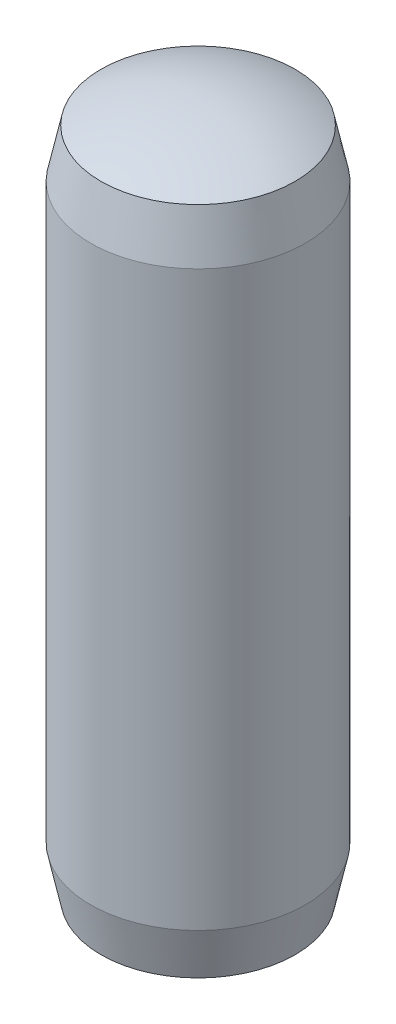
ISO-10303-21;
HEADER;
FILE_DESCRIPTION(('STEP AP214'),'2;1');
FILE_NAME('part.step','',(''),(''),'','','');
FILE_SCHEMA(('AUTOMOTIVE_DESIGN { 1 0 10303 214 1 1 1 1 }'));
ENDSEC;
DATA;
#1=APPLICATION_CONTEXT('core data for automotive mechanical design processes');
#2=APPLICATION_PROTOCOL_DEFINITION('international standard','automotive_design',2000,#1);
#3=PRODUCT_CONTEXT('',#1,'mechanical');
#4=PRODUCT('Part','Part','',(#3));
#5=PRODUCT_RELATED_PRODUCT_CATEGORY('part','',(#4));
#6=PRODUCT_DEFINITION_FORMATION('','',#4);
#7=PRODUCT_DEFINITION_CONTEXT('part definition',#1,'design');
#8=PRODUCT_DEFINITION('design','',#6,#7);
#9=PRODUCT_DEFINITION_SHAPE('','',#8);
#10=(LENGTH_UNIT() NAMED_UNIT(*) SI_UNIT(.MILLI.,.METRE.));
#11=(NAMED_UNIT(*) PLANE_ANGLE_UNIT() SI_UNIT($,.RADIAN.));
#12=(NAMED_UNIT(*) SI_UNIT($,.STERADIAN.) SOLID_ANGLE_UNIT());
#13=UNCERTAINTY_MEASURE_WITH_UNIT(LENGTH_MEASURE(1.E-05),#10,'distance_accuracy_value','');
#14=(GEOMETRIC_REPRESENTATION_CONTEXT(3) GLOBAL_UNCERTAINTY_ASSIGNED_CONTEXT((#13)) GLOBAL_UNIT_ASSIGNED_CONTEXT((#10,
#11,#12)) REPRESENTATION_CONTEXT('',''));
#15=CARTESIAN_POINT('',(0.,0.,0.));
#16=DIRECTION('',(0.,0.,1.));
#17=DIRECTION('',(1.,0.,0.));
#18=AXIS2_PLACEMENT_3D('',#15,#16,#17);
#19=CARTESIAN_POINT('',(0.,5.,0.));
#20=DIRECTION('',(0.,-1.,0.));
#21=DIRECTION('',(0.,0.,-1.));
#22=AXIS2_PLACEMENT_3D('',#19,#20,#21);
#23=CYLINDRICAL_SURFACE('',#22,0.75);
#24=CARTESIAN_POINT('',(0.,4.5,0.));
#25=DIRECTION('',(0.,-1.,0.));
#26=DIRECTION('',(0.,0.,-1.));
#27=AXIS2_PLACEMENT_3D('',#24,#25,#26);
#28=CIRCLE('',#27,0.75);
#29=CARTESIAN_POINT('',(0.,4.5,-0.75));
#30=VERTEX_POINT('',#29);
#31=EDGE_CURVE('E11',#30,#30,#28,.T.);
#32=ORIENTED_EDGE('',*,*,#31,.T.);
#33=EDGE_LOOP('',(#32));
#34=FACE_BOUND('',#33,.T.);
#35=CARTESIAN_POINT('',(0.,0.5,0.));
#36=DIRECTION('',(0.,-1.,0.));
#37=DIRECTION('',(0.,0.,-1.));
#38=AXIS2_PLACEMENT_3D('',#35,#36,#37);
#39=CIRCLE('',#38,0.75);
#40=CARTESIAN_POINT('',(0.,0.5,-0.75));
#41=VERTEX_POINT('',#40);
#42=EDGE_CURVE('E56',#41,#41,#39,.T.);
#43=ORIENTED_EDGE('',*,*,#42,.F.);
#44=EDGE_LOOP('',(#43));
#45=FACE_BOUND('',#44,.T.);
#46=ADVANCED_FACE('F34',(#34,#45),#23,.T.);
#47=CARTESIAN_POINT('',(0.,4.5,0.));
#48=DIRECTION('',(0.,-1.,0.));
#49=DIRECTION('',(0.,0.,-1.));
#50=AXIS2_PLACEMENT_3D('',#47,#48,#49);
#51=CONICAL_SURFACE('',#50,0.75,0.209439510239312);
#52=CARTESIAN_POINT('',(0.,4.83794161592573,0.));
#53=DIRECTION('',(0.,-1.,0.));
#54=DIRECTION('',(0.,0.,-1.));
#55=AXIS2_PLACEMENT_3D('',#52,#53,#54);
#56=CIRCLE('',#55,0.678168292073619);
#57=CARTESIAN_POINT('',(0.,4.83794161592573,-0.678168292073619));
#58=VERTEX_POINT('',#57);
#59=EDGE_CURVE('E41',#58,#58,#56,.T.);
#60=ORIENTED_EDGE('',*,*,#59,.T.);
#61=EDGE_LOOP('',(#60));
#62=FACE_BOUND('',#61,.T.);
#63=ORIENTED_EDGE('',*,*,#31,.F.);
#64=EDGE_LOOP('',(#63));
#65=FACE_BOUND('',#64,.T.);
#66=ADVANCED_FACE('F51',(#62,#65),#51,.T.);
#67=CARTESIAN_POINT('',(0.,3.5,0.));
#68=DIRECTION('',(0.,-1.,0.));
#69=DIRECTION('',(1.,0.,0.));
#70=AXIS2_PLACEMENT_3D('',#67,#68,#69);
#71=SPHERICAL_SURFACE('',#70,1.5);
#72=CARTESIAN_POINT('',(0.,5.,0.));
#73=VERTEX_POINT('',#72);
#74=VERTEX_LOOP('',#73);
#75=FACE_BOUND('',#74,.T.);
#76=ORIENTED_EDGE('',*,*,#59,.F.);
#77=EDGE_LOOP('',(#76));
#78=FACE_BOUND('',#77,.T.);
#79=ADVANCED_FACE('F47',(#75,#78),#71,.T.);
#80=CARTESIAN_POINT('',(0.,0.162058384074271,0.));
#81=DIRECTION('',(0.,1.,0.));
#82=DIRECTION('',(0.,0.,1.));
#83=AXIS2_PLACEMENT_3D('',#80,#81,#82);
#84=CONICAL_SURFACE('',#83,0.678168292073618,0.209439510239312);
#85=ORIENTED_EDGE('',*,*,#42,.T.);
#86=EDGE_LOOP('',(#85));
#87=FACE_BOUND('',#86,.T.);
#88=CARTESIAN_POINT('',(0.,0.162058384074271,0.));
#89=DIRECTION('',(0.,-1.,0.));
#90=DIRECTION('',(0.,0.,-1.));
#91=AXIS2_PLACEMENT_3D('',#88,#89,#90);
#92=CIRCLE('',#91,0.678168292073618);
#93=CARTESIAN_POINT('',(0.,0.162058384074271,-0.678168292073618));
#94=VERTEX_POINT('',#93);
#95=EDGE_CURVE('E58',#94,#94,#92,.T.);
#96=ORIENTED_EDGE('',*,*,#95,.F.);
#97=EDGE_LOOP('',(#96));
#98=FACE_BOUND('',#97,.T.);
#99=ADVANCED_FACE('F50',(#87,#98),#84,.T.);
#100=CARTESIAN_POINT('',(0.,1.5,0.));
#101=DIRECTION('',(0.,-1.,0.));
#102=DIRECTION('',(1.,0.,0.));
#103=AXIS2_PLACEMENT_3D('',#100,#101,#102);
#104=SPHERICAL_SURFACE('',#103,1.5);
#105=CARTESIAN_POINT('',(0.,0.,0.));
#106=VERTEX_POINT('',#105);
#107=VERTEX_LOOP('',#106);
#108=FACE_BOUND('',#107,.T.);
#109=ORIENTED_EDGE('',*,*,#95,.T.);
#110=EDGE_LOOP('',(#109));
#111=FACE_BOUND('',#110,.T.);
#112=ADVANCED_FACE('F64',(#108,#111),#104,.T.);
#113=CLOSED_SHELL('',(#46,#66,#79,#99,#112));
#114=MANIFOLD_SOLID_BREP('B2',#113);
#115=ADVANCED_BREP_SHAPE_REPRESENTATION('',(#18,#114),#14);
#116=SHAPE_DEFINITION_REPRESENTATION(#9,#115);
ENDSEC;
END-ISO-10303-21;
